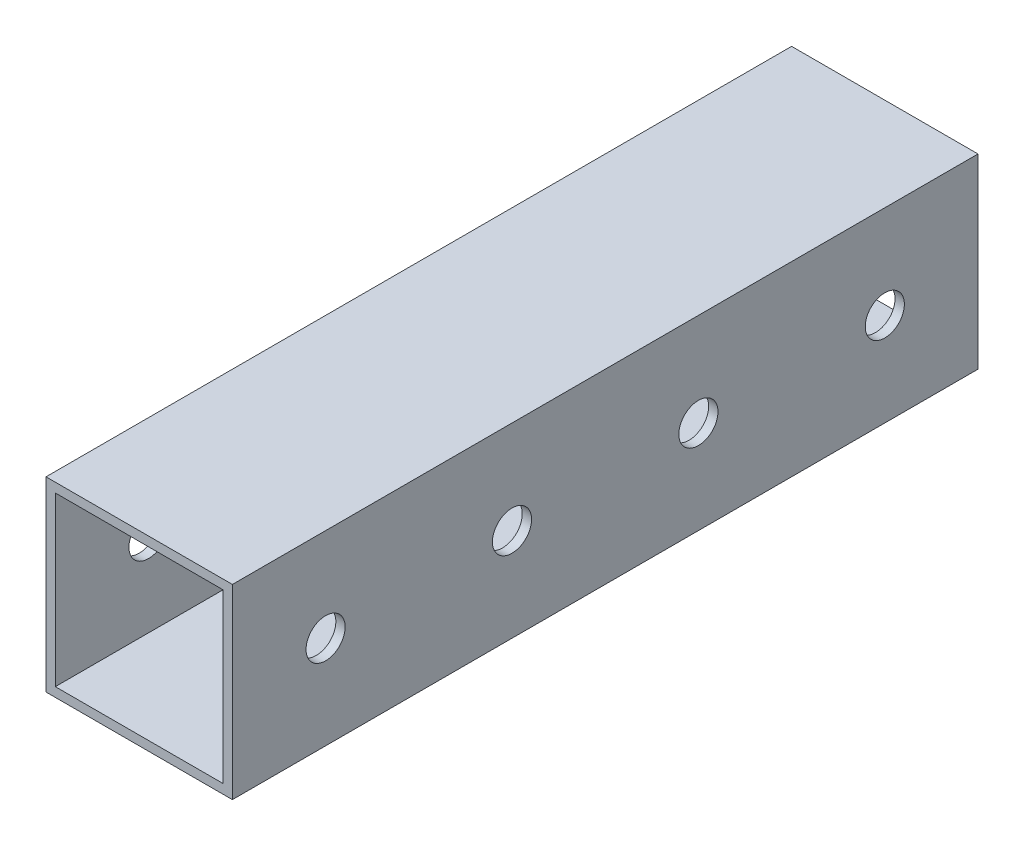
ISO-10303-21;
HEADER;
FILE_DESCRIPTION(('STEP AP214'),'2;1');
FILE_NAME('part.step','',(''),(''),'','','');
FILE_SCHEMA(('AUTOMOTIVE_DESIGN { 1 0 10303 214 1 1 1 1 }'));
ENDSEC;
DATA;
#1=APPLICATION_CONTEXT('core data for automotive mechanical design processes');
#2=APPLICATION_PROTOCOL_DEFINITION('international standard','automotive_design',2000,#1);
#3=PRODUCT_CONTEXT('',#1,'mechanical');
#4=PRODUCT('Part','Part','',(#3));
#5=PRODUCT_RELATED_PRODUCT_CATEGORY('part','',(#4));
#6=PRODUCT_DEFINITION_FORMATION('','',#4);
#7=PRODUCT_DEFINITION_CONTEXT('part definition',#1,'design');
#8=PRODUCT_DEFINITION('design','',#6,#7);
#9=PRODUCT_DEFINITION_SHAPE('','',#8);
#10=(LENGTH_UNIT() NAMED_UNIT(*) SI_UNIT(.MILLI.,.METRE.));
#11=(NAMED_UNIT(*) PLANE_ANGLE_UNIT() SI_UNIT($,.RADIAN.));
#12=(NAMED_UNIT(*) SI_UNIT($,.STERADIAN.) SOLID_ANGLE_UNIT());
#13=UNCERTAINTY_MEASURE_WITH_UNIT(LENGTH_MEASURE(1.E-05),#10,'distance_accuracy_value','');
#14=(GEOMETRIC_REPRESENTATION_CONTEXT(3) GLOBAL_UNCERTAINTY_ASSIGNED_CONTEXT((#13)) GLOBAL_UNIT_ASSIGNED_CONTEXT((#10,
#11,#12)) REPRESENTATION_CONTEXT('',''));
#15=CARTESIAN_POINT('',(0.,0.,0.));
#16=DIRECTION('',(0.,0.,1.));
#17=DIRECTION('',(1.,0.,0.));
#18=AXIS2_PLACEMENT_3D('',#15,#16,#17);
#19=CARTESIAN_POINT('',(-10.,0.,9.99999999999999));
#20=DIRECTION('',(1.,0.,0.));
#21=DIRECTION('',(0.,0.,-1.));
#22=AXIS2_PLACEMENT_3D('',#19,#20,#21);
#23=CYLINDRICAL_SURFACE('',#22,2.1);
#24=CARTESIAN_POINT('',(-9.,0.,9.99999999999999));
#25=DIRECTION('',(-1.,0.,0.));
#26=DIRECTION('',(0.,-1.,0.));
#27=AXIS2_PLACEMENT_3D('',#24,#25,#26);
#28=CIRCLE('',#27,2.1);
#29=CARTESIAN_POINT('',(-9.,-2.1,9.99999999999999));
#30=VERTEX_POINT('',#29);
#31=EDGE_CURVE('E176',#30,#30,#28,.T.);
#32=ORIENTED_EDGE('',*,*,#31,.F.);
#33=EDGE_LOOP('',(#32));
#34=FACE_BOUND('',#33,.T.);
#35=CARTESIAN_POINT('',(-10.,0.,9.99999999999999));
#36=DIRECTION('',(1.,0.,0.));
#37=DIRECTION('',(0.,0.,-1.));
#38=AXIS2_PLACEMENT_3D('',#35,#36,#37);
#39=CIRCLE('',#38,2.1);
#40=CARTESIAN_POINT('',(-10.,0.,7.89999999999999));
#41=VERTEX_POINT('',#40);
#42=EDGE_CURVE('E202',#41,#41,#39,.F.);
#43=ORIENTED_EDGE('',*,*,#42,.T.);
#44=EDGE_LOOP('',(#43));
#45=FACE_BOUND('',#44,.T.);
#46=ADVANCED_FACE('F38',(#34,#45),#23,.F.);
#47=CARTESIAN_POINT('',(-10.,0.,50.));
#48=DIRECTION('',(1.,0.,0.));
#49=DIRECTION('',(0.,0.,-1.));
#50=AXIS2_PLACEMENT_3D('',#47,#48,#49);
#51=CYLINDRICAL_SURFACE('',#50,2.1);
#52=CARTESIAN_POINT('',(-9.,0.,50.));
#53=DIRECTION('',(-1.,0.,0.));
#54=DIRECTION('',(0.,-1.,0.));
#55=AXIS2_PLACEMENT_3D('',#52,#53,#54);
#56=CIRCLE('',#55,2.1);
#57=CARTESIAN_POINT('',(-9.,-2.1,50.));
#58=VERTEX_POINT('',#57);
#59=EDGE_CURVE('E172',#58,#58,#56,.F.);
#60=ORIENTED_EDGE('',*,*,#59,.T.);
#61=EDGE_LOOP('',(#60));
#62=FACE_BOUND('',#61,.T.);
#63=CARTESIAN_POINT('',(-10.,0.,50.));
#64=DIRECTION('',(1.,0.,0.));
#65=DIRECTION('',(0.,0.,-1.));
#66=AXIS2_PLACEMENT_3D('',#63,#64,#65);
#67=CIRCLE('',#66,2.1);
#68=CARTESIAN_POINT('',(-10.,0.,47.9));
#69=VERTEX_POINT('',#68);
#70=EDGE_CURVE('E195',#69,#69,#67,.T.);
#71=ORIENTED_EDGE('',*,*,#70,.F.);
#72=EDGE_LOOP('',(#71));
#73=FACE_BOUND('',#72,.T.);
#74=ADVANCED_FACE('F273',(#62,#73),#51,.F.);
#75=CARTESIAN_POINT('',(-10.,0.,30.));
#76=DIRECTION('',(1.,0.,0.));
#77=DIRECTION('',(0.,0.,-1.));
#78=AXIS2_PLACEMENT_3D('',#75,#76,#77);
#79=CYLINDRICAL_SURFACE('',#78,2.1);
#80=CARTESIAN_POINT('',(-9.,0.,30.));
#81=DIRECTION('',(-1.,0.,0.));
#82=DIRECTION('',(0.,-1.,0.));
#83=AXIS2_PLACEMENT_3D('',#80,#81,#82);
#84=CIRCLE('',#83,2.1);
#85=CARTESIAN_POINT('',(-9.,-2.1,30.));
#86=VERTEX_POINT('',#85);
#87=EDGE_CURVE('E168',#86,#86,#84,.T.);
#88=ORIENTED_EDGE('',*,*,#87,.F.);
#89=EDGE_LOOP('',(#88));
#90=FACE_BOUND('',#89,.T.);
#91=CARTESIAN_POINT('',(-10.,0.,30.));
#92=DIRECTION('',(-1.,0.,0.));
#93=DIRECTION('',(0.,0.,1.));
#94=AXIS2_PLACEMENT_3D('',#91,#92,#93);
#95=CIRCLE('',#94,2.1);
#96=CARTESIAN_POINT('',(-10.,0.,32.1));
#97=VERTEX_POINT('',#96);
#98=EDGE_CURVE('E180',#97,#97,#95,.T.);
#99=ORIENTED_EDGE('',*,*,#98,.T.);
#100=EDGE_LOOP('',(#99));
#101=FACE_BOUND('',#100,.T.);
#102=ADVANCED_FACE('F299',(#90,#101),#79,.F.);
#103=CARTESIAN_POINT('',(-10.,0.,70.));
#104=DIRECTION('',(1.,0.,0.));
#105=DIRECTION('',(0.,0.,-1.));
#106=AXIS2_PLACEMENT_3D('',#103,#104,#105);
#107=CYLINDRICAL_SURFACE('',#106,2.1);
#108=CARTESIAN_POINT('',(-9.,0.,70.));
#109=DIRECTION('',(-1.,0.,0.));
#110=DIRECTION('',(0.,-1.,0.));
#111=AXIS2_PLACEMENT_3D('',#108,#109,#110);
#112=CIRCLE('',#111,2.1);
#113=CARTESIAN_POINT('',(-9.,-2.1,70.));
#114=VERTEX_POINT('',#113);
#115=EDGE_CURVE('E42',#114,#114,#112,.F.);
#116=ORIENTED_EDGE('',*,*,#115,.T.);
#117=EDGE_LOOP('',(#116));
#118=FACE_BOUND('',#117,.T.);
#119=CARTESIAN_POINT('',(-10.,0.,70.));
#120=DIRECTION('',(1.,0.,0.));
#121=DIRECTION('',(0.,0.,-1.));
#122=AXIS2_PLACEMENT_3D('',#119,#120,#121);
#123=CIRCLE('',#122,2.1);
#124=CARTESIAN_POINT('',(-10.,0.,67.9));
#125=VERTEX_POINT('',#124);
#126=EDGE_CURVE('E181',#125,#125,#123,.T.);
#127=ORIENTED_EDGE('',*,*,#126,.F.);
#128=EDGE_LOOP('',(#127));
#129=FACE_BOUND('',#128,.T.);
#130=ADVANCED_FACE('F279',(#118,#129),#107,.F.);
#131=CARTESIAN_POINT('',(10.,10.,80.));
#132=DIRECTION('',(-1.,0.,0.));
#133=DIRECTION('',(0.,0.,1.));
#134=AXIS2_PLACEMENT_3D('',#131,#132,#133);
#135=PLANE('',#134);
#136=CARTESIAN_POINT('',(10.,0.,50.));
#137=DIRECTION('',(1.,0.,0.));
#138=DIRECTION('',(0.,0.,-1.));
#139=AXIS2_PLACEMENT_3D('',#136,#137,#138);
#140=CIRCLE('',#139,2.1);
#141=CARTESIAN_POINT('',(10.,0.,47.9));
#142=VERTEX_POINT('',#141);
#143=EDGE_CURVE('E206',#142,#142,#140,.T.);
#144=ORIENTED_EDGE('',*,*,#143,.F.);
#145=EDGE_LOOP('',(#144));
#146=FACE_BOUND('',#145,.T.);
#147=CARTESIAN_POINT('',(10.,0.,9.99999999999999));
#148=DIRECTION('',(1.,0.,0.));
#149=DIRECTION('',(0.,0.,-1.));
#150=AXIS2_PLACEMENT_3D('',#147,#148,#149);
#151=CIRCLE('',#150,2.1);
#152=CARTESIAN_POINT('',(10.,0.,7.89999999999999));
#153=VERTEX_POINT('',#152);
#154=EDGE_CURVE('E190',#153,#153,#151,.F.);
#155=ORIENTED_EDGE('',*,*,#154,.T.);
#156=EDGE_LOOP('',(#155));
#157=FACE_BOUND('',#156,.T.);
#158=DIRECTION('',(0.,1.,0.));
#159=VECTOR('',#158,1.);
#160=CARTESIAN_POINT('',(10.,10.,0.));
#161=LINE('',#160,#159);
#162=CARTESIAN_POINT('',(10.,-10.,0.));
#163=VERTEX_POINT('',#162);
#164=CARTESIAN_POINT('',(10.,10.,0.));
#165=VERTEX_POINT('',#164);
#166=EDGE_CURVE('E185',#163,#165,#161,.T.);
#167=ORIENTED_EDGE('',*,*,#166,.T.);
#168=DIRECTION('',(0.,0.,-1.));
#169=VECTOR('',#168,1.);
#170=CARTESIAN_POINT('',(10.,10.,80.));
#171=LINE('',#170,#169);
#172=CARTESIAN_POINT('',(10.,10.,80.));
#173=VERTEX_POINT('',#172);
#174=EDGE_CURVE('E11',#173,#165,#171,.T.);
#175=ORIENTED_EDGE('',*,*,#174,.F.);
#176=DIRECTION('',(0.,1.,0.));
#177=VECTOR('',#176,1.);
#178=CARTESIAN_POINT('',(10.,10.,80.));
#179=LINE('',#178,#177);
#180=CARTESIAN_POINT('',(10.,-10.,80.));
#181=VERTEX_POINT('',#180);
#182=EDGE_CURVE('E213',#181,#173,#179,.T.);
#183=ORIENTED_EDGE('',*,*,#182,.F.);
#184=DIRECTION('',(0.,0.,-1.));
#185=VECTOR('',#184,1.);
#186=CARTESIAN_POINT('',(10.,-10.,80.));
#187=LINE('',#186,#185);
#188=EDGE_CURVE('E227',#181,#163,#187,.T.);
#189=ORIENTED_EDGE('',*,*,#188,.T.);
#190=EDGE_LOOP('',(#167,#175,#183,#189));
#191=FACE_BOUND('',#190,.T.);
#192=CARTESIAN_POINT('',(10.,0.,30.));
#193=DIRECTION('',(-1.,0.,0.));
#194=DIRECTION('',(0.,0.,1.));
#195=AXIS2_PLACEMENT_3D('',#192,#193,#194);
#196=CIRCLE('',#195,2.1);
#197=CARTESIAN_POINT('',(10.,0.,32.1));
#198=VERTEX_POINT('',#197);
#199=EDGE_CURVE('E191',#198,#198,#196,.T.);
#200=ORIENTED_EDGE('',*,*,#199,.T.);
#201=EDGE_LOOP('',(#200));
#202=FACE_BOUND('',#201,.T.);
#203=CARTESIAN_POINT('',(10.,0.,70.));
#204=DIRECTION('',(1.,0.,0.));
#205=DIRECTION('',(0.,0.,-1.));
#206=AXIS2_PLACEMENT_3D('',#203,#204,#205);
#207=CIRCLE('',#206,2.1);
#208=CARTESIAN_POINT('',(10.,0.,67.9));
#209=VERTEX_POINT('',#208);
#210=EDGE_CURVE('E186',#209,#209,#207,.T.);
#211=ORIENTED_EDGE('',*,*,#210,.F.);
#212=EDGE_LOOP('',(#211));
#213=FACE_BOUND('',#212,.T.);
#214=ADVANCED_FACE('F40',(#146,#157,#191,#202,#213),#135,.F.);
#215=CARTESIAN_POINT('',(-10.,10.,80.));
#216=DIRECTION('',(1.,0.,0.));
#217=DIRECTION('',(0.,1.,0.));
#218=AXIS2_PLACEMENT_3D('',#215,#216,#217);
#219=PLANE('',#218);
#220=ORIENTED_EDGE('',*,*,#70,.T.);
#221=EDGE_LOOP('',(#220));
#222=FACE_BOUND('',#221,.T.);
#223=ORIENTED_EDGE('',*,*,#42,.F.);
#224=EDGE_LOOP('',(#223));
#225=FACE_BOUND('',#224,.T.);
#226=DIRECTION('',(0.,-1.,0.));
#227=VECTOR('',#226,1.);
#228=CARTESIAN_POINT('',(-10.,10.,0.));
#229=LINE('',#228,#227);
#230=CARTESIAN_POINT('',(-10.,10.,0.));
#231=VERTEX_POINT('',#230);
#232=CARTESIAN_POINT('',(-10.,-10.,0.));
#233=VERTEX_POINT('',#232);
#234=EDGE_CURVE('E234',#231,#233,#229,.T.);
#235=ORIENTED_EDGE('',*,*,#234,.T.);
#236=DIRECTION('',(0.,0.,-1.));
#237=VECTOR('',#236,1.);
#238=CARTESIAN_POINT('',(-10.,-10.,80.));
#239=LINE('',#238,#237);
#240=CARTESIAN_POINT('',(-10.,-10.,80.));
#241=VERTEX_POINT('',#240);
#242=EDGE_CURVE('E242',#241,#233,#239,.T.);
#243=ORIENTED_EDGE('',*,*,#242,.F.);
#244=DIRECTION('',(0.,-1.,0.));
#245=VECTOR('',#244,1.);
#246=CARTESIAN_POINT('',(-10.,10.,80.));
#247=LINE('',#246,#245);
#248=CARTESIAN_POINT('',(-10.,10.,80.));
#249=VERTEX_POINT('',#248);
#250=EDGE_CURVE('E221',#249,#241,#247,.T.);
#251=ORIENTED_EDGE('',*,*,#250,.F.);
#252=DIRECTION('',(0.,0.,-1.));
#253=VECTOR('',#252,1.);
#254=CARTESIAN_POINT('',(-10.,10.,80.));
#255=LINE('',#254,#253);
#256=EDGE_CURVE('E48',#249,#231,#255,.T.);
#257=ORIENTED_EDGE('',*,*,#256,.T.);
#258=EDGE_LOOP('',(#235,#243,#251,#257));
#259=FACE_BOUND('',#258,.T.);
#260=ORIENTED_EDGE('',*,*,#98,.F.);
#261=EDGE_LOOP('',(#260));
#262=FACE_BOUND('',#261,.T.);
#263=ORIENTED_EDGE('',*,*,#126,.T.);
#264=EDGE_LOOP('',(#263));
#265=FACE_BOUND('',#264,.T.);
#266=ADVANCED_FACE('F278',(#222,#225,#259,#262,#265),#219,.F.);
#267=CARTESIAN_POINT('',(-10.,10.,80.));
#268=DIRECTION('',(0.,-1.,0.));
#269=DIRECTION('',(0.,0.,-1.));
#270=AXIS2_PLACEMENT_3D('',#267,#268,#269);
#271=PLANE('',#270);
#272=DIRECTION('',(-1.,0.,0.));
#273=VECTOR('',#272,1.);
#274=CARTESIAN_POINT('',(-10.,10.,0.));
#275=LINE('',#274,#273);
#276=EDGE_CURVE('E231',#165,#231,#275,.T.);
#277=ORIENTED_EDGE('',*,*,#276,.T.);
#278=ORIENTED_EDGE('',*,*,#256,.F.);
#279=DIRECTION('',(-1.,0.,0.));
#280=VECTOR('',#279,1.);
#281=CARTESIAN_POINT('',(-10.,10.,80.));
#282=LINE('',#281,#280);
#283=EDGE_CURVE('E217',#173,#249,#282,.T.);
#284=ORIENTED_EDGE('',*,*,#283,.F.);
#285=ORIENTED_EDGE('',*,*,#174,.T.);
#286=EDGE_LOOP('',(#277,#278,#284,#285));
#287=FACE_BOUND('',#286,.T.);
#288=ADVANCED_FACE('F331',(#287),#271,.F.);
#289=CARTESIAN_POINT('',(-10.,-10.,80.));
#290=DIRECTION('',(0.,1.,0.));
#291=DIRECTION('',(0.,0.,1.));
#292=AXIS2_PLACEMENT_3D('',#289,#290,#291);
#293=PLANE('',#292);
#294=DIRECTION('',(1.,0.,0.));
#295=VECTOR('',#294,1.);
#296=CARTESIAN_POINT('',(-10.,-10.,0.));
#297=LINE('',#296,#295);
#298=EDGE_CURVE('E218',#233,#163,#297,.T.);
#299=ORIENTED_EDGE('',*,*,#298,.T.);
#300=ORIENTED_EDGE('',*,*,#188,.F.);
#301=DIRECTION('',(1.,0.,0.));
#302=VECTOR('',#301,1.);
#303=CARTESIAN_POINT('',(-10.,-10.,80.));
#304=LINE('',#303,#302);
#305=EDGE_CURVE('E224',#241,#181,#304,.T.);
#306=ORIENTED_EDGE('',*,*,#305,.F.);
#307=ORIENTED_EDGE('',*,*,#242,.T.);
#308=EDGE_LOOP('',(#299,#300,#306,#307));
#309=FACE_BOUND('',#308,.T.);
#310=ADVANCED_FACE('F325',(#309),#293,.F.);
#311=CARTESIAN_POINT('',(0.,0.,80.));
#312=DIRECTION('',(0.,0.,1.));
#313=DIRECTION('',(1.,0.,0.));
#314=AXIS2_PLACEMENT_3D('',#311,#312,#313);
#315=PLANE('',#314);
#316=DIRECTION('',(0.,1.,0.));
#317=VECTOR('',#316,1.);
#318=CARTESIAN_POINT('',(-9.,9.,80.));
#319=LINE('',#318,#317);
#320=CARTESIAN_POINT('',(-9.,-9.,80.));
#321=VERTEX_POINT('',#320);
#322=CARTESIAN_POINT('',(-9.,9.,80.));
#323=VERTEX_POINT('',#322);
#324=EDGE_CURVE('E109',#321,#323,#319,.T.);
#325=ORIENTED_EDGE('',*,*,#324,.T.);
#326=DIRECTION('',(1.,0.,0.));
#327=VECTOR('',#326,1.);
#328=CARTESIAN_POINT('',(9.,9.,80.));
#329=LINE('',#328,#327);
#330=CARTESIAN_POINT('',(9.,9.,80.));
#331=VERTEX_POINT('',#330);
#332=EDGE_CURVE('E119',#323,#331,#329,.T.);
#333=ORIENTED_EDGE('',*,*,#332,.T.);
#334=DIRECTION('',(0.,-1.,0.));
#335=VECTOR('',#334,1.);
#336=CARTESIAN_POINT('',(9.,9.,80.));
#337=LINE('',#336,#335);
#338=CARTESIAN_POINT('',(9.,-9.,80.));
#339=VERTEX_POINT('',#338);
#340=EDGE_CURVE('E56',#331,#339,#337,.T.);
#341=ORIENTED_EDGE('',*,*,#340,.T.);
#342=DIRECTION('',(-1.,0.,0.));
#343=VECTOR('',#342,1.);
#344=CARTESIAN_POINT('',(9.,-9.,80.));
#345=LINE('',#344,#343);
#346=EDGE_CURVE('E116',#339,#321,#345,.T.);
#347=ORIENTED_EDGE('',*,*,#346,.T.);
#348=EDGE_LOOP('',(#325,#333,#341,#347));
#349=FACE_BOUND('',#348,.T.);
#350=ORIENTED_EDGE('',*,*,#182,.T.);
#351=ORIENTED_EDGE('',*,*,#283,.T.);
#352=ORIENTED_EDGE('',*,*,#250,.T.);
#353=ORIENTED_EDGE('',*,*,#305,.T.);
#354=EDGE_LOOP('',(#350,#351,#352,#353));
#355=FACE_BOUND('',#354,.T.);
#356=ADVANCED_FACE('F124',(#349,#355),#315,.T.);
#357=CARTESIAN_POINT('',(0.,0.,0.));
#358=DIRECTION('',(0.,0.,1.));
#359=DIRECTION('',(1.,0.,0.));
#360=AXIS2_PLACEMENT_3D('',#357,#358,#359);
#361=PLANE('',#360);
#362=DIRECTION('',(1.,0.,0.));
#363=VECTOR('',#362,1.);
#364=CARTESIAN_POINT('',(9.,9.,0.));
#365=LINE('',#364,#363);
#366=CARTESIAN_POINT('',(-9.,9.,0.));
#367=VERTEX_POINT('',#366);
#368=CARTESIAN_POINT('',(9.,9.,0.));
#369=VERTEX_POINT('',#368);
#370=EDGE_CURVE('E141',#367,#369,#365,.T.);
#371=ORIENTED_EDGE('',*,*,#370,.F.);
#372=DIRECTION('',(0.,1.,0.));
#373=VECTOR('',#372,1.);
#374=CARTESIAN_POINT('',(-9.,9.,0.));
#375=LINE('',#374,#373);
#376=CARTESIAN_POINT('',(-9.,-9.,0.));
#377=VERTEX_POINT('',#376);
#378=EDGE_CURVE('E64',#377,#367,#375,.T.);
#379=ORIENTED_EDGE('',*,*,#378,.F.);
#380=DIRECTION('',(-1.,0.,0.));
#381=VECTOR('',#380,1.);
#382=CARTESIAN_POINT('',(9.,-9.,0.));
#383=LINE('',#382,#381);
#384=CARTESIAN_POINT('',(9.,-9.,0.));
#385=VERTEX_POINT('',#384);
#386=EDGE_CURVE('E128',#385,#377,#383,.T.);
#387=ORIENTED_EDGE('',*,*,#386,.F.);
#388=DIRECTION('',(0.,-1.,0.));
#389=VECTOR('',#388,1.);
#390=CARTESIAN_POINT('',(9.,9.,0.));
#391=LINE('',#390,#389);
#392=EDGE_CURVE('E132',#369,#385,#391,.T.);
#393=ORIENTED_EDGE('',*,*,#392,.F.);
#394=EDGE_LOOP('',(#371,#379,#387,#393));
#395=FACE_BOUND('',#394,.T.);
#396=ORIENTED_EDGE('',*,*,#166,.F.);
#397=ORIENTED_EDGE('',*,*,#298,.F.);
#398=ORIENTED_EDGE('',*,*,#234,.F.);
#399=ORIENTED_EDGE('',*,*,#276,.F.);
#400=EDGE_LOOP('',(#396,#397,#398,#399));
#401=FACE_BOUND('',#400,.T.);
#402=ADVANCED_FACE('F313',(#395,#401),#361,.F.);
#403=CARTESIAN_POINT('',(9.,0.,9.99999999999999));
#404=DIRECTION('',(1.,0.,0.));
#405=DIRECTION('',(0.,1.,0.));
#406=AXIS2_PLACEMENT_3D('',#403,#404,#405);
#407=CIRCLE('',#406,2.1);
#408=CARTESIAN_POINT('',(9.,2.1,9.99999999999999));
#409=VERTEX_POINT('',#408);
#410=EDGE_CURVE('E164',#409,#409,#407,.T.);
#411=ORIENTED_EDGE('',*,*,#410,.F.);
#412=EDGE_LOOP('',(#411));
#413=FACE_BOUND('',#412,.T.);
#414=ORIENTED_EDGE('',*,*,#154,.F.);
#415=EDGE_LOOP('',(#414));
#416=FACE_BOUND('',#415,.T.);
#417=ADVANCED_FACE('F271',(#413,#416),#23,.F.);
#418=CARTESIAN_POINT('',(9.,0.,50.));
#419=DIRECTION('',(1.,0.,0.));
#420=DIRECTION('',(0.,1.,0.));
#421=AXIS2_PLACEMENT_3D('',#418,#419,#420);
#422=CIRCLE('',#421,2.1);
#423=CARTESIAN_POINT('',(9.,2.1,50.));
#424=VERTEX_POINT('',#423);
#425=EDGE_CURVE('E160',#424,#424,#422,.F.);
#426=ORIENTED_EDGE('',*,*,#425,.T.);
#427=EDGE_LOOP('',(#426));
#428=FACE_BOUND('',#427,.T.);
#429=ORIENTED_EDGE('',*,*,#143,.T.);
#430=EDGE_LOOP('',(#429));
#431=FACE_BOUND('',#430,.T.);
#432=ADVANCED_FACE('F267',(#428,#431),#51,.F.);
#433=CARTESIAN_POINT('',(9.,0.,30.));
#434=DIRECTION('',(1.,0.,0.));
#435=DIRECTION('',(0.,1.,0.));
#436=AXIS2_PLACEMENT_3D('',#433,#434,#435);
#437=CIRCLE('',#436,2.1);
#438=CARTESIAN_POINT('',(9.,2.1,30.));
#439=VERTEX_POINT('',#438);
#440=EDGE_CURVE('E156',#439,#439,#437,.T.);
#441=ORIENTED_EDGE('',*,*,#440,.F.);
#442=EDGE_LOOP('',(#441));
#443=FACE_BOUND('',#442,.T.);
#444=ORIENTED_EDGE('',*,*,#199,.F.);
#445=EDGE_LOOP('',(#444));
#446=FACE_BOUND('',#445,.T.);
#447=ADVANCED_FACE('F270',(#443,#446),#79,.F.);
#448=CARTESIAN_POINT('',(9.,0.,70.));
#449=DIRECTION('',(1.,0.,0.));
#450=DIRECTION('',(0.,1.,0.));
#451=AXIS2_PLACEMENT_3D('',#448,#449,#450);
#452=CIRCLE('',#451,2.1);
#453=CARTESIAN_POINT('',(9.,2.1,70.));
#454=VERTEX_POINT('',#453);
#455=EDGE_CURVE('E150',#454,#454,#452,.F.);
#456=ORIENTED_EDGE('',*,*,#455,.T.);
#457=EDGE_LOOP('',(#456));
#458=FACE_BOUND('',#457,.T.);
#459=ORIENTED_EDGE('',*,*,#210,.T.);
#460=EDGE_LOOP('',(#459));
#461=FACE_BOUND('',#460,.T.);
#462=ADVANCED_FACE('F252',(#458,#461),#107,.F.);
#463=CARTESIAN_POINT('',(-9.,9.,80.));
#464=DIRECTION('',(-1.,0.,0.));
#465=DIRECTION('',(0.,-1.,0.));
#466=AXIS2_PLACEMENT_3D('',#463,#464,#465);
#467=PLANE('',#466);
#468=ORIENTED_EDGE('',*,*,#31,.T.);
#469=EDGE_LOOP('',(#468));
#470=FACE_BOUND('',#469,.T.);
#471=ORIENTED_EDGE('',*,*,#115,.F.);
#472=EDGE_LOOP('',(#471));
#473=FACE_BOUND('',#472,.T.);
#474=ORIENTED_EDGE('',*,*,#378,.T.);
#475=DIRECTION('',(0.,0.,-1.));
#476=VECTOR('',#475,1.);
#477=CARTESIAN_POINT('',(-9.,9.,80.));
#478=LINE('',#477,#476);
#479=EDGE_CURVE('E104',#323,#367,#478,.T.);
#480=ORIENTED_EDGE('',*,*,#479,.F.);
#481=ORIENTED_EDGE('',*,*,#324,.F.);
#482=DIRECTION('',(0.,0.,-1.));
#483=VECTOR('',#482,1.);
#484=CARTESIAN_POINT('',(-9.,-9.,80.));
#485=LINE('',#484,#483);
#486=EDGE_CURVE('E147',#321,#377,#485,.T.);
#487=ORIENTED_EDGE('',*,*,#486,.T.);
#488=EDGE_LOOP('',(#474,#480,#481,#487));
#489=FACE_BOUND('',#488,.T.);
#490=ORIENTED_EDGE('',*,*,#87,.T.);
#491=EDGE_LOOP('',(#490));
#492=FACE_BOUND('',#491,.T.);
#493=ORIENTED_EDGE('',*,*,#59,.F.);
#494=EDGE_LOOP('',(#493));
#495=FACE_BOUND('',#494,.T.);
#496=ADVANCED_FACE('F106',(#470,#473,#489,#492,#495),#467,.F.);
#497=CARTESIAN_POINT('',(9.,9.,80.));
#498=DIRECTION('',(1.,0.,0.));
#499=DIRECTION('',(0.,1.,0.));
#500=AXIS2_PLACEMENT_3D('',#497,#498,#499);
#501=PLANE('',#500);
#502=ORIENTED_EDGE('',*,*,#410,.T.);
#503=EDGE_LOOP('',(#502));
#504=FACE_BOUND('',#503,.T.);
#505=ORIENTED_EDGE('',*,*,#455,.F.);
#506=EDGE_LOOP('',(#505));
#507=FACE_BOUND('',#506,.T.);
#508=ORIENTED_EDGE('',*,*,#392,.T.);
#509=DIRECTION('',(0.,0.,-1.));
#510=VECTOR('',#509,1.);
#511=CARTESIAN_POINT('',(9.,-9.,80.));
#512=LINE('',#511,#510);
#513=EDGE_CURVE('E151',#339,#385,#512,.T.);
#514=ORIENTED_EDGE('',*,*,#513,.F.);
#515=ORIENTED_EDGE('',*,*,#340,.F.);
#516=DIRECTION('',(0.,0.,-1.));
#517=VECTOR('',#516,1.);
#518=CARTESIAN_POINT('',(9.,9.,80.));
#519=LINE('',#518,#517);
#520=EDGE_CURVE('E115',#331,#369,#519,.T.);
#521=ORIENTED_EDGE('',*,*,#520,.T.);
#522=EDGE_LOOP('',(#508,#514,#515,#521));
#523=FACE_BOUND('',#522,.T.);
#524=ORIENTED_EDGE('',*,*,#440,.T.);
#525=EDGE_LOOP('',(#524));
#526=FACE_BOUND('',#525,.T.);
#527=ORIENTED_EDGE('',*,*,#425,.F.);
#528=EDGE_LOOP('',(#527));
#529=FACE_BOUND('',#528,.T.);
#530=ADVANCED_FACE('F255',(#504,#507,#523,#526,#529),#501,.F.);
#531=CARTESIAN_POINT('',(9.,-9.,80.));
#532=DIRECTION('',(0.,-1.,0.));
#533=DIRECTION('',(0.,0.,-1.));
#534=AXIS2_PLACEMENT_3D('',#531,#532,#533);
#535=PLANE('',#534);
#536=ORIENTED_EDGE('',*,*,#386,.T.);
#537=ORIENTED_EDGE('',*,*,#486,.F.);
#538=ORIENTED_EDGE('',*,*,#346,.F.);
#539=ORIENTED_EDGE('',*,*,#513,.T.);
#540=EDGE_LOOP('',(#536,#537,#538,#539));
#541=FACE_BOUND('',#540,.T.);
#542=ADVANCED_FACE('F257',(#541),#535,.F.);
#543=CARTESIAN_POINT('',(9.,9.,80.));
#544=DIRECTION('',(0.,1.,0.));
#545=DIRECTION('',(0.,0.,1.));
#546=AXIS2_PLACEMENT_3D('',#543,#544,#545);
#547=PLANE('',#546);
#548=ORIENTED_EDGE('',*,*,#370,.T.);
#549=ORIENTED_EDGE('',*,*,#520,.F.);
#550=ORIENTED_EDGE('',*,*,#332,.F.);
#551=ORIENTED_EDGE('',*,*,#479,.T.);
#552=EDGE_LOOP('',(#548,#549,#550,#551));
#553=FACE_BOUND('',#552,.T.);
#554=ADVANCED_FACE('F120',(#553),#547,.F.);
#555=CLOSED_SHELL('',(#46,#74,#102,#130,#214,#266,#288,#310,#356,#402,#417,#432,#447,#462,#496,
#530,#542,#554));
#556=MANIFOLD_SOLID_BREP('B2',#555);
#557=ADVANCED_BREP_SHAPE_REPRESENTATION('',(#18,#556),#14);
#558=SHAPE_DEFINITION_REPRESENTATION(#9,#557);
ENDSEC;
END-ISO-10303-21;
